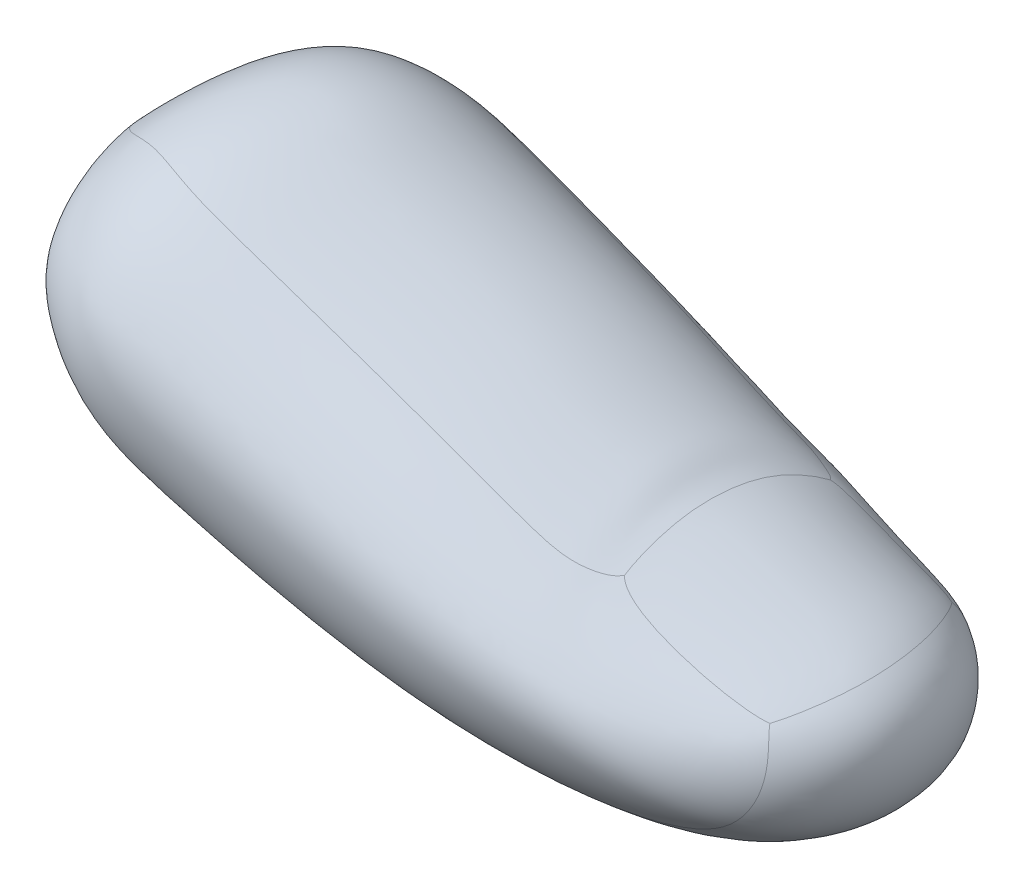
ISO-10303-21;
HEADER;
FILE_DESCRIPTION(('STEP AP214'),'2;1');
FILE_NAME('part.step','',(''),(''),'','','');
FILE_SCHEMA(('AUTOMOTIVE_DESIGN { 1 0 10303 214 1 1 1 1 }'));
ENDSEC;
DATA;
#1=APPLICATION_CONTEXT('core data for automotive mechanical design processes');
#2=APPLICATION_PROTOCOL_DEFINITION('international standard','automotive_design',2000,#1);
#3=PRODUCT_CONTEXT('',#1,'mechanical');
#4=PRODUCT('Part','Part','',(#3));
#5=PRODUCT_RELATED_PRODUCT_CATEGORY('part','',(#4));
#6=PRODUCT_DEFINITION_FORMATION('','',#4);
#7=PRODUCT_DEFINITION_CONTEXT('part definition',#1,'design');
#8=PRODUCT_DEFINITION('design','',#6,#7);
#9=PRODUCT_DEFINITION_SHAPE('','',#8);
#10=(LENGTH_UNIT() NAMED_UNIT(*) SI_UNIT(.MILLI.,.METRE.));
#11=(NAMED_UNIT(*) PLANE_ANGLE_UNIT() SI_UNIT($,.RADIAN.));
#12=(NAMED_UNIT(*) SI_UNIT($,.STERADIAN.) SOLID_ANGLE_UNIT());
#13=UNCERTAINTY_MEASURE_WITH_UNIT(LENGTH_MEASURE(1.E-05),#10,'distance_accuracy_value','');
#14=(GEOMETRIC_REPRESENTATION_CONTEXT(3) GLOBAL_UNCERTAINTY_ASSIGNED_CONTEXT((#13)) GLOBAL_UNIT_ASSIGNED_CONTEXT((#10,
#11,#12)) REPRESENTATION_CONTEXT('',''));
#15=CARTESIAN_POINT('',(0.,0.,0.));
#16=DIRECTION('',(0.,0.,1.));
#17=DIRECTION('',(1.,0.,0.));
#18=AXIS2_PLACEMENT_3D('',#15,#16,#17);
#19=CARTESIAN_POINT('',(776.248806926799,1297.13342170859,-16.5124378638908));
#20=CARTESIAN_POINT('',(776.243734939801,1297.17552307911,-16.8530550608123));
#21=CARTESIAN_POINT('',(776.440179296877,1297.34700811274,-17.8863612600429));
#22=CARTESIAN_POINT('',(776.469154670857,1297.18374944249,-19.5442080268799));
#23=CARTESIAN_POINT('',(776.303599867894,1296.7728971948,-20.2968129283823));
#24=CARTESIAN_POINT('',(776.31862177474,1296.64842207664,-20.5640886608683));
#25=CARTESIAN_POINT('',(776.412340965516,1297.30563996506,-16.2957291132153));
#26=CARTESIAN_POINT('',(776.56573103024,1297.56206096258,-16.7602547563611));
#27=CARTESIAN_POINT('',(776.829819008422,1297.81650707709,-17.8927326607063));
#28=CARTESIAN_POINT('',(776.861647729009,1297.64870278292,-19.7466520769386));
#29=CARTESIAN_POINT('',(776.632328903728,1297.13254949626,-20.5641596812097));
#30=CARTESIAN_POINT('',(776.490497246085,1296.7660106683,-20.8313999035141));
#31=CARTESIAN_POINT('',(777.196725960595,1297.98610527035,-15.2749707851825));
#32=CARTESIAN_POINT('',(777.331276181575,1298.31400007654,-16.0139073965886));
#33=CARTESIAN_POINT('',(777.600564939605,1298.69698334476,-17.7379171714884));
#34=CARTESIAN_POINT('',(777.645676933045,1298.47729333256,-20.3688216034117));
#35=CARTESIAN_POINT('',(777.430025455144,1297.6947320278,-21.6235197386159));
#36=CARTESIAN_POINT('',(777.3140356685,1297.1861044855,-22.0864027830923));
#37=CARTESIAN_POINT('',(779.068832037003,1298.90255451431,-14.5666994001202));
#38=CARTESIAN_POINT('',(779.243214461083,1299.32762032967,-15.524943924543));
#39=CARTESIAN_POINT('',(779.592422099675,1299.82412768138,-17.7608479096512));
#40=CARTESIAN_POINT('',(779.651087738069,1299.53938447969,-21.1730063951572));
#41=CARTESIAN_POINT('',(779.371698491866,1298.52503466165,-22.7998706151153));
#42=CARTESIAN_POINT('',(779.221375833895,1297.86570560166,-23.3999988915442));
#43=CARTESIAN_POINT('',(781.137603947715,1298.72497398352,-13.789576662406));
#44=CARTESIAN_POINT('',(781.36203529643,1299.22799066092,-14.8805923137662));
#45=CARTESIAN_POINT('',(781.885381407909,1299.84020747154,-17.4331271926069));
#46=CARTESIAN_POINT('',(782.265199849768,1299.54681845549,-21.3654366174796));
#47=CARTESIAN_POINT('',(782.195884489295,1298.3835461396,-23.2358135257908));
#48=CARTESIAN_POINT('',(782.151139320157,1297.62781870469,-23.9246706749869));
#49=CARTESIAN_POINT('',(783.889838462615,1297.52614326891,-13.9911079579648));
#50=CARTESIAN_POINT('',(784.027592381335,1298.03868880364,-15.059462714367));
#51=CARTESIAN_POINT('',(784.351015984833,1298.69745566611,-17.5644791917382));
#52=CARTESIAN_POINT('',(784.564727001333,1298.50551771249,-21.4288920164398));
#53=CARTESIAN_POINT('',(784.623203116717,1297.37528398652,-23.2733227409778));
#54=CARTESIAN_POINT('',(784.645568107469,1296.63679717278,-23.9561654320516));
#55=CARTESIAN_POINT('',(786.642079739642,1296.32732889029,-14.1926554873652));
#56=CARTESIAN_POINT('',(786.693144502818,1296.84939779074,-15.2383424052471));
#57=CARTESIAN_POINT('',(786.816648808278,1297.55470163886,-17.695835837937));
#58=CARTESIAN_POINT('',(786.864254152899,1297.46421696949,-21.4923474154));
#59=CARTESIAN_POINT('',(787.050518534205,1296.36703489964,-23.3108365993658));
#60=CARTESIAN_POINT('',(787.139981959307,1295.64578321543,-23.9876578887444));
#61=CARTESIAN_POINT('',(790.579349242589,1294.68499986567,-14.3905401011191));
#62=CARTESIAN_POINT('',(790.507565681173,1295.23486662918,-15.4087233281733));
#63=CARTESIAN_POINT('',(790.418432803363,1296.01583178992,-17.8164877398132));
#64=CARTESIAN_POINT('',(790.708995264565,1295.81178412399,-21.5598729908704));
#65=CARTESIAN_POINT('',(790.993866539675,1294.73850384191,-23.3194968612997));
#66=CARTESIAN_POINT('',(791.12179996451,1294.05280241703,-23.9707695484859));
#67=CARTESIAN_POINT('',(793.130545298139,1293.51072890705,-14.5447897773409));
#68=CARTESIAN_POINT('',(792.947888702681,1294.0688478498,-15.5317055585784));
#69=CARTESIAN_POINT('',(792.702311392216,1294.89225444332,-17.8926251407684));
#70=CARTESIAN_POINT('',(792.946395828154,1294.68906459456,-21.5645280390747));
#71=CARTESIAN_POINT('',(793.365812155512,1293.63506851349,-23.2785885483427));
#72=CARTESIAN_POINT('',(793.565948614163,1292.98223761643,-23.9099319567921));
#73=CARTESIAN_POINT('',(794.732470310774,1292.76371035453,-14.6856988715293));
#74=CARTESIAN_POINT('',(794.536024430702,1293.30900814682,-15.6426884743088));
#75=CARTESIAN_POINT('',(794.269895566784,1294.16205750971,-17.9962528621609));
#76=CARTESIAN_POINT('',(794.388305968912,1294.0232269031,-21.5877781331473));
#77=CARTESIAN_POINT('',(794.868732383544,1292.97526751071,-23.2968316212878));
#78=CARTESIAN_POINT('',(795.087589318305,1292.34915151292,-23.9127162158432));
#79=CARTESIAN_POINT('',(795.517143002034,1292.48110111188,-14.8957503684959));
#80=CARTESIAN_POINT('',(795.308942573039,1292.98396390087,-15.7751300446617));
#81=CARTESIAN_POINT('',(795.045114662433,1293.82163369162,-18.0734370109038));
#82=CARTESIAN_POINT('',(795.180259167151,1293.68358608956,-21.6097071785736));
#83=CARTESIAN_POINT('',(795.617671553086,1292.69940193109,-23.2964969121603));
#84=CARTESIAN_POINT('',(795.846008956027,1292.12382045966,-23.8806161344801));
#85=CARTESIAN_POINT('',(796.101894475691,1292.27286161092,-15.2205516571337));
#86=CARTESIAN_POINT('',(795.860511558456,1292.68358679256,-15.9496177170946));
#87=CARTESIAN_POINT('',(795.564903207338,1293.49023119101,-18.0879114205995));
#88=CARTESIAN_POINT('',(795.700122880264,1293.3521969394,-21.6242162847972));
#89=CARTESIAN_POINT('',(796.311537027804,1292.36376197722,-23.2071871037177));
#90=CARTESIAN_POINT('',(796.584028807795,1291.90198063366,-23.7121938882911));
#91=CARTESIAN_POINT('',(796.456400474653,1292.20702068511,-15.5128963194457));
#92=CARTESIAN_POINT('',(796.209409281284,1292.5222695586,-16.1063894811202));
#93=CARTESIAN_POINT('',(795.911483395004,1293.26929350593,-18.0975764168251));
#94=CARTESIAN_POINT('',(796.046651786795,1293.13124887279,-21.6338612480672));
#95=CARTESIAN_POINT('',(796.660516372291,1292.21377119728,-23.1291603436407));
#96=CARTESIAN_POINT('',(796.960567964272,1291.85930140401,-23.5544745046175));
#97=CARTESIAN_POINT('',(796.590715491962,1292.21578600641,-15.7162678871557));
#98=CARTESIAN_POINT('',(796.534377403913,1292.3777931038,-16.1147002518535));
#99=CARTESIAN_POINT('',(796.361311181774,1293.07803222366,-18.0999428042168));
#100=CARTESIAN_POINT('',(796.506495763757,1292.95301315593,-21.6330902927138));
#101=CARTESIAN_POINT('',(796.97887115642,1292.08173109551,-23.1236609486948));
#102=CARTESIAN_POINT('',(797.072787289703,1291.88943126724,-23.4090368543352));
#103=(BOUNDED_SURFACE() B_SPLINE_SURFACE(3,3,((#19,#20,#21,#22,#23,#24),(#25,#26,#27,#28,#29,
#30),(#31,#32,#33,#34,#35,#36),(#37,#38,#39,#40,#41,#42),(#43,#44,#45,#46,#47,#48),(#49,#50,#51,
#52,#53,#54),(#55,#56,#57,#58,#59,#60),(#61,#62,#63,#64,#65,#66),(#67,#68,#69,#70,#71,#72),(#73,
#74,#75,#76,#77,#78),(#79,#80,#81,#82,#83,#84),(#85,#86,#87,#88,#89,#90),(#91,#92,#93,#94,#95,
#96),(#97,#98,#99,#100,#101,#102)),.UNSPECIFIED.,.F.,.F.,.F.) B_SPLINE_SURFACE_WITH_KNOTS((4,1,
1,1,1,1,1,1,1,1,1,4),(4,1,1,4),(0.,1.,2.,3.,4.,5.,6.,7.,8.,9.,10.,11.),(0.,1.,2.,3.),
.UNSPECIFIED.) GEOMETRIC_REPRESENTATION_ITEM() RATIONAL_B_SPLINE_SURFACE(((0.75,1.,1.,1.,1.,
0.75),(1.,1.,1.,1.,1.,1.),(1.,1.,1.,1.,1.,1.),(1.,1.,1.,1.,1.,1.),(1.,1.,1.,1.,1.,1.),(1.,1.,1.,
1.,1.,1.),(1.,1.,1.,1.,1.,1.),(1.,1.,1.,1.,1.,1.),(1.,1.,1.,1.,1.,1.),(1.,1.,1.,1.,1.,1.),(1.,
1.,1.,1.,1.,1.),(1.,1.,1.,1.,1.,1.),(1.,1.,1.,1.,1.,1.),(0.75,1.,1.,1.,1.,0.75))) REPRESENTATION_ITEM('') SURFACE());
#104=CARTESIAN_POINT('',(796.590715491962,1292.21578600641,-15.7162678871557));
#105=CARTESIAN_POINT('',(796.456400474653,1292.20702068511,-15.5128963194457));
#106=CARTESIAN_POINT('',(796.101894475691,1292.27286161092,-15.2205516571337));
#107=CARTESIAN_POINT('',(795.517143002034,1292.48110111188,-14.8957503684959));
#108=CARTESIAN_POINT('',(794.732470310774,1292.76371035453,-14.6856988715293));
#109=CARTESIAN_POINT('',(793.130545298139,1293.51072890705,-14.5447897773409));
#110=CARTESIAN_POINT('',(790.579349242589,1294.68499986567,-14.3905401011191));
#111=CARTESIAN_POINT('',(786.642079739642,1296.32732889029,-14.1926554873652));
#112=CARTESIAN_POINT('',(783.889838462615,1297.52614326891,-13.9911079579648));
#113=CARTESIAN_POINT('',(781.137603947715,1298.72497398352,-13.789576662406));
#114=CARTESIAN_POINT('',(779.068832037003,1298.90255451431,-14.5666994001202));
#115=CARTESIAN_POINT('',(777.196725960595,1297.98610527035,-15.2749707851825));
#116=CARTESIAN_POINT('',(776.412340965516,1297.30563996506,-16.2957291132153));
#117=CARTESIAN_POINT('',(776.248806926799,1297.13342170859,-16.5124378638908));
#118=(BOUNDED_CURVE() B_SPLINE_CURVE(3,(#104,#105,#106,#107,#108,#109,#110,#111,#112,#113,#114,
#115,#116,#117),.UNSPECIFIED.,.F.,.F.) B_SPLINE_CURVE_WITH_KNOTS((4,1,1,1,1,1,1,1,1,1,1,4),(0.,
1.,2.,3.,4.,5.,6.,7.,8.,9.,10.,11.),
.UNSPECIFIED.) CURVE() GEOMETRIC_REPRESENTATION_ITEM() RATIONAL_B_SPLINE_CURVE((0.75,1.,1.,1.,
1.,1.,1.,1.,1.,1.,1.,1.,1.,0.75)) REPRESENTATION_ITEM(''));
#119=CARTESIAN_POINT('',(796.590715491962,1292.21578600641,-15.7162678871557));
#120=VERTEX_POINT('',#119);
#121=CARTESIAN_POINT('',(776.248806926798,1297.13342170859,-16.5124378638908));
#122=VERTEX_POINT('',#121);
#123=EDGE_CURVE('E89',#120,#122,#118,.T.);
#124=CARTESIAN_POINT('',(797.072787289703,1291.88943126724,-23.4090368543352));
#125=CARTESIAN_POINT('',(796.97887115642,1292.08173109551,-23.1236609486948));
#126=CARTESIAN_POINT('',(796.506495763757,1292.95301315593,-21.6330902927138));
#127=CARTESIAN_POINT('',(796.361311181774,1293.07803222366,-18.0999428042168));
#128=CARTESIAN_POINT('',(796.534377403913,1292.3777931038,-16.1147002518535));
#129=CARTESIAN_POINT('',(796.590715491962,1292.21578600641,-15.7162678871557));
#130=(BOUNDED_CURVE() B_SPLINE_CURVE(3,(#124,#125,#126,#127,#128,#129),.UNSPECIFIED.,.F.,
.F.) B_SPLINE_CURVE_WITH_KNOTS((4,1,1,4),(0.,1.,2.,3.),
.UNSPECIFIED.) CURVE() GEOMETRIC_REPRESENTATION_ITEM() RATIONAL_B_SPLINE_CURVE((0.75,1.,1.,1.,
1.,0.75)) REPRESENTATION_ITEM(''));
#131=CARTESIAN_POINT('',(797.072787289703,1291.88943126724,-23.4090368543352));
#132=VERTEX_POINT('',#131);
#133=EDGE_CURVE('E84',#132,#120,#130,.T.);
#134=CARTESIAN_POINT('',(797.072787289703,1291.88943126724,-23.4090368543352));
#135=CARTESIAN_POINT('',(796.960567964272,1291.85930140401,-23.5544745046175));
#136=CARTESIAN_POINT('',(796.584028807795,1291.90198063366,-23.7121938882911));
#137=CARTESIAN_POINT('',(795.846008956027,1292.12382045966,-23.8806161344801));
#138=CARTESIAN_POINT('',(795.087589318305,1292.34915151292,-23.9127162158432));
#139=CARTESIAN_POINT('',(793.565948614163,1292.98223761643,-23.9099319567921));
#140=CARTESIAN_POINT('',(791.12179996451,1294.05280241703,-23.9707695484859));
#141=CARTESIAN_POINT('',(787.139981959307,1295.64578321543,-23.9876578887444));
#142=CARTESIAN_POINT('',(784.645568107469,1296.63679717278,-23.9561654320516));
#143=CARTESIAN_POINT('',(782.151139320157,1297.62781870469,-23.9246706749869));
#144=CARTESIAN_POINT('',(779.221375833895,1297.86570560166,-23.3999988915442));
#145=CARTESIAN_POINT('',(777.3140356685,1297.1861044855,-22.0864027830923));
#146=CARTESIAN_POINT('',(776.490497246085,1296.7660106683,-20.8313999035141));
#147=CARTESIAN_POINT('',(776.31862177474,1296.64842207664,-20.5640886608683));
#148=(BOUNDED_CURVE() B_SPLINE_CURVE(3,(#134,#135,#136,#137,#138,#139,#140,#141,#142,#143,#144,
#145,#146,#147),.UNSPECIFIED.,.F.,.F.) B_SPLINE_CURVE_WITH_KNOTS((4,1,1,1,1,1,1,1,1,1,1,4),(0.,
1.,2.,3.,4.,5.,6.,7.,8.,9.,10.,11.),
.UNSPECIFIED.) CURVE() GEOMETRIC_REPRESENTATION_ITEM() RATIONAL_B_SPLINE_CURVE((0.75,1.,1.,1.,
1.,1.,1.,1.,1.,1.,1.,1.,1.,0.75)) REPRESENTATION_ITEM(''));
#149=CARTESIAN_POINT('',(776.31862177474,1296.64842207664,-20.5640886608683));
#150=VERTEX_POINT('',#149);
#151=EDGE_CURVE('E86',#150,#132,#148,.F.);
#152=CARTESIAN_POINT('',(776.31862177474,1296.64842207664,-20.5640886608683));
#153=CARTESIAN_POINT('',(776.303599867894,1296.7728971948,-20.2968129283823));
#154=CARTESIAN_POINT('',(776.469154670857,1297.18374944249,-19.5442080268799));
#155=CARTESIAN_POINT('',(776.440179296877,1297.34700811274,-17.8863612600429));
#156=CARTESIAN_POINT('',(776.243734939801,1297.17552307911,-16.8530550608123));
#157=CARTESIAN_POINT('',(776.248806926799,1297.13342170859,-16.5124378638908));
#158=(BOUNDED_CURVE() B_SPLINE_CURVE(3,(#152,#153,#154,#155,#156,#157),.UNSPECIFIED.,.F.,
.F.) B_SPLINE_CURVE_WITH_KNOTS((4,1,1,4),(0.,1.,2.,3.),
.UNSPECIFIED.) CURVE() GEOMETRIC_REPRESENTATION_ITEM() RATIONAL_B_SPLINE_CURVE((0.75,1.,1.,1.,
1.,0.75)) REPRESENTATION_ITEM(''));
#159=EDGE_CURVE('E107',#122,#150,#158,.F.);
#160=ORIENTED_EDGE('',*,*,#123,.F.);
#161=ORIENTED_EDGE('',*,*,#133,.F.);
#162=ORIENTED_EDGE('',*,*,#151,.F.);
#163=ORIENTED_EDGE('',*,*,#159,.F.);
#164=EDGE_LOOP('',(#160,#161,#162,#163));
#165=FACE_BOUND('',#164,.T.);
#166=ADVANCED_FACE('F37',(#165),#103,.T.);
#167=CARTESIAN_POINT('',(801.677664036057,1289.87355686285,-23.6272043992934));
#168=CARTESIAN_POINT('',(801.93773134174,1289.98035043801,-23.3350456484098));
#169=CARTESIAN_POINT('',(802.927357566541,1290.36773113354,-21.8237874687661));
#170=CARTESIAN_POINT('',(803.365335577512,1290.36169307218,-18.3419020633773));
#171=CARTESIAN_POINT('',(802.484501050872,1289.96587676347,-16.2777055081201));
#172=CARTESIAN_POINT('',(802.221422913571,1289.87016587372,-15.8550067801961));
#173=CARTESIAN_POINT('',(801.30547355706,1290.00478857986,-23.7291268132962));
#174=CARTESIAN_POINT('',(801.453417689439,1290.34960744718,-23.246731725521));
#175=CARTESIAN_POINT('',(802.277799686771,1290.79546724773,-21.7213542840307));
#176=CARTESIAN_POINT('',(802.661252695364,1290.7699825286,-18.3347868913965));
#177=CARTESIAN_POINT('',(801.919853451861,1290.3545177215,-16.2975516731374));
#178=CARTESIAN_POINT('',(801.807560045421,1290.01663090788,-15.6535804987481));
#179=CARTESIAN_POINT('',(799.982076190121,1290.4496174616,-23.7447967393803));
#180=CARTESIAN_POINT('',(800.180783642023,1290.81261105273,-23.1988858359838));
#181=CARTESIAN_POINT('',(800.644187503643,1291.42663554945,-21.6373999894228));
#182=CARTESIAN_POINT('',(800.943165315516,1291.34045341071,-18.1834694091974));
#183=CARTESIAN_POINT('',(800.448576256541,1290.84689302981,-16.1131265408997));
#184=CARTESIAN_POINT('',(800.228174341764,1290.55241075604,-15.3586968600128));
#185=CARTESIAN_POINT('',(798.034313535603,1291.28797573986,-23.6799684740343));
#186=CARTESIAN_POINT('',(798.221665732574,1291.57152136656,-23.1741907341076));
#187=CARTESIAN_POINT('',(798.459186742044,1292.28278263823,-21.6195905527203));
#188=CARTESIAN_POINT('',(798.263869927941,1292.34266349743,-18.1021097449499));
#189=CARTESIAN_POINT('',(797.81032029429,1291.81672806379,-15.9994823414614));
#190=CARTESIAN_POINT('',(797.601875424743,1291.5972641644,-15.2680498941088));
#191=CARTESIAN_POINT('',(797.27892274839,1291.72726130223,-23.5489751096825));
#192=CARTESIAN_POINT('',(797.297225940547,1291.94969099373,-23.1181615537598));
#193=CARTESIAN_POINT('',(796.966339740719,1292.77477743908,-21.6323193373605));
#194=CARTESIAN_POINT('',(796.811138968535,1292.8867709414,-18.1023091916085));
#195=CARTESIAN_POINT('',(796.859345526562,1292.23331664901,-16.1230110225867));
#196=CARTESIAN_POINT('',(796.781368597282,1292.06254423031,-15.5212070901681));
#197=CARTESIAN_POINT('',(797.072787289703,1291.88943126724,-23.4090368543352));
#198=CARTESIAN_POINT('',(796.97887115642,1292.08173109551,-23.1236609486948));
#199=CARTESIAN_POINT('',(796.506495763757,1292.95301315593,-21.6330902927138));
#200=CARTESIAN_POINT('',(796.361311181774,1293.07803222366,-18.0999428042168));
#201=CARTESIAN_POINT('',(796.534377403913,1292.3777931038,-16.1147002518535));
#202=CARTESIAN_POINT('',(796.590715491962,1292.21578600641,-15.7162678871557));
#203=(BOUNDED_SURFACE() B_SPLINE_SURFACE(3,3,((#167,#168,#169,#170,#171,#172),(#173,#174,#175,
#176,#177,#178),(#179,#180,#181,#182,#183,#184),(#185,#186,#187,#188,#189,#190),(#191,#192,#193,
#194,#195,#196),(#197,#198,#199,#200,#201,#202)),.UNSPECIFIED.,.F.,.F.,
.F.) B_SPLINE_SURFACE_WITH_KNOTS((4,1,1,4),(4,1,1,4),(0.,1.,2.,3.),(0.,1.,2.,3.),
.UNSPECIFIED.) GEOMETRIC_REPRESENTATION_ITEM() RATIONAL_B_SPLINE_SURFACE(((0.75,1.,1.,1.,1.,
0.75),(1.,1.,1.,1.,1.,1.),(1.,1.,1.,1.,1.,1.),(1.,1.,1.,1.,1.,1.),(1.,1.,1.,1.,1.,1.),(0.75,1.,
1.,1.,1.,0.75))) REPRESENTATION_ITEM('') SURFACE());
#204=CARTESIAN_POINT('',(801.677664036057,1289.87355686285,-23.6272043992934));
#205=CARTESIAN_POINT('',(801.30547355706,1290.00478857986,-23.7291268132962));
#206=CARTESIAN_POINT('',(799.982076190121,1290.4496174616,-23.7447967393803));
#207=CARTESIAN_POINT('',(798.034313535603,1291.28797573986,-23.6799684740343));
#208=CARTESIAN_POINT('',(797.27892274839,1291.72726130223,-23.5489751096825));
#209=CARTESIAN_POINT('',(797.072787289703,1291.88943126724,-23.4090368543352));
#210=(BOUNDED_CURVE() B_SPLINE_CURVE(3,(#204,#205,#206,#207,#208,#209),.UNSPECIFIED.,.F.,
.F.) B_SPLINE_CURVE_WITH_KNOTS((4,1,1,4),(0.,1.,2.,3.),
.UNSPECIFIED.) CURVE() GEOMETRIC_REPRESENTATION_ITEM() RATIONAL_B_SPLINE_CURVE((0.75,1.,1.,1.,
1.,0.75)) REPRESENTATION_ITEM(''));
#211=CARTESIAN_POINT('',(801.677664036057,1289.87355686285,-23.6272043992934));
#212=VERTEX_POINT('',#211);
#213=EDGE_CURVE('E92',#132,#212,#210,.F.);
#214=CARTESIAN_POINT('',(796.590715491962,1292.21578600641,-15.7162678871557));
#215=CARTESIAN_POINT('',(796.781368597282,1292.06254423031,-15.5212070901681));
#216=CARTESIAN_POINT('',(797.601875424743,1291.5972641644,-15.2680498941088));
#217=CARTESIAN_POINT('',(800.228174341764,1290.55241075604,-15.3586968600128));
#218=CARTESIAN_POINT('',(801.807560045421,1290.01663090788,-15.6535804987481));
#219=CARTESIAN_POINT('',(802.221422913571,1289.87016587372,-15.8550067801961));
#220=(BOUNDED_CURVE() B_SPLINE_CURVE(3,(#214,#215,#216,#217,#218,#219),.UNSPECIFIED.,.F.,
.F.) B_SPLINE_CURVE_WITH_KNOTS((4,1,1,4),(0.,1.,2.,3.),
.UNSPECIFIED.) CURVE() GEOMETRIC_REPRESENTATION_ITEM() RATIONAL_B_SPLINE_CURVE((0.75,1.,1.,1.,
1.,0.75)) REPRESENTATION_ITEM(''));
#221=CARTESIAN_POINT('',(802.221422913571,1289.87016587372,-15.8550067801961));
#222=VERTEX_POINT('',#221);
#223=EDGE_CURVE('E121',#222,#120,#220,.F.);
#224=CARTESIAN_POINT('',(802.221422913571,1289.87016587372,-15.8550067801961));
#225=CARTESIAN_POINT('',(802.484501050872,1289.96587676347,-16.2777055081201));
#226=CARTESIAN_POINT('',(803.365335577512,1290.36169307218,-18.3419020633773));
#227=CARTESIAN_POINT('',(802.927357566541,1290.36773113354,-21.8237874687661));
#228=CARTESIAN_POINT('',(801.93773134174,1289.98035043801,-23.3350456484098));
#229=CARTESIAN_POINT('',(801.677664036057,1289.87355686285,-23.6272043992934));
#230=(BOUNDED_CURVE() B_SPLINE_CURVE(3,(#224,#225,#226,#227,#228,#229),.UNSPECIFIED.,.F.,
.F.) B_SPLINE_CURVE_WITH_KNOTS((4,1,1,4),(0.,1.,2.,3.),
.UNSPECIFIED.) CURVE() GEOMETRIC_REPRESENTATION_ITEM() RATIONAL_B_SPLINE_CURVE((0.75,1.,1.,1.,
1.,0.75)) REPRESENTATION_ITEM(''));
#231=EDGE_CURVE('E60',#212,#222,#230,.F.);
#232=ORIENTED_EDGE('',*,*,#213,.F.);
#233=ORIENTED_EDGE('',*,*,#133,.T.);
#234=ORIENTED_EDGE('',*,*,#223,.F.);
#235=ORIENTED_EDGE('',*,*,#231,.F.);
#236=EDGE_LOOP('',(#232,#233,#234,#235));
#237=FACE_BOUND('',#236,.T.);
#238=ADVANCED_FACE('F94',(#237),#203,.T.);
#239=CARTESIAN_POINT('',(801.677664036057,1289.87355686285,-23.6272043992934));
#240=CARTESIAN_POINT('',(801.30547355706,1290.00478857986,-23.7291268132962));
#241=CARTESIAN_POINT('',(799.982076190121,1290.4496174616,-23.7447967393803));
#242=CARTESIAN_POINT('',(798.034313535603,1291.28797573986,-23.6799684740343));
#243=CARTESIAN_POINT('',(797.27892274839,1291.72726130223,-23.5489751096825));
#244=CARTESIAN_POINT('',(797.072787289703,1291.88943126724,-23.4090368543352));
#245=CARTESIAN_POINT('',(801.789787209361,1289.63553157069,-23.8174407361742));
#246=CARTESIAN_POINT('',(801.157529424671,1289.65996971254,-24.2115219010606));
#247=CARTESIAN_POINT('',(799.783368738217,1290.08662387047,-24.290707642766));
#248=CARTESIAN_POINT('',(797.846961338641,1291.00443011315,-24.185746213961));
#249=CARTESIAN_POINT('',(797.260619556243,1291.50483161074,-23.9797886656052));
#250=CARTESIAN_POINT('',(796.960567964272,1291.85930140401,-23.5544745046175));
#251=CARTESIAN_POINT('',(802.238400224159,1288.66181152076,-24.1722470919776));
#252=CARTESIAN_POINT('',(801.390134892487,1288.72655404381,-24.6157248106495));
#253=CARTESIAN_POINT('',(799.451942792215,1289.24867400266,-24.9128654098018));
#254=CARTESIAN_POINT('',(797.335073560245,1290.58150887801,-24.6542569922913));
#255=CARTESIAN_POINT('',(796.856520587795,1291.44019929011,-24.2172006728752));
#256=CARTESIAN_POINT('',(796.584028807795,1291.90198063366,-23.7121938882911));
#257=CARTESIAN_POINT('',(801.588602166399,1286.25027337419,-24.1173791523864));
#258=CARTESIAN_POINT('',(800.708624906545,1286.71163973044,-24.6368445577358));
#259=CARTESIAN_POINT('',(798.608339808858,1288.0896835084,-25.2592363760777));
#260=CARTESIAN_POINT('',(796.550283584738,1290.230097261,-25.1144225125144));
#261=CARTESIAN_POINT('',(796.074346358959,1291.54823898824,-24.4647353568108));
#262=CARTESIAN_POINT('',(795.846008956027,1292.12382045966,-23.8806161344801));
#263=CARTESIAN_POINT('',(798.711875081204,1285.17799798553,-24.1766152617788));
#264=CARTESIAN_POINT('',(798.222380590192,1285.81785968365,-24.7879134934103));
#265=CARTESIAN_POINT('',(796.921730481825,1287.51681549545,-25.5417342984943));
#266=CARTESIAN_POINT('',(795.701447577472,1290.26653091635,-25.2830857004903));
#267=CARTESIAN_POINT('',(795.306446253067,1291.72303551514,-24.5286008103986));
#268=CARTESIAN_POINT('',(795.087589318305,1292.34915151292,-23.9127162158432));
#269=CARTESIAN_POINT('',(795.196768106608,1285.21501089638,-24.2339016324822));
#270=CARTESIAN_POINT('',(795.138255378947,1285.93079282373,-24.8783739663544));
#271=CARTESIAN_POINT('',(794.766624233523,1287.67237511111,-25.6133833284538));
#272=CARTESIAN_POINT('',(794.14721458003,1290.77207921229,-25.3525884897281));
#273=CARTESIAN_POINT('',(793.766085072806,1292.3294067194,-24.5412753652308));
#274=CARTESIAN_POINT('',(793.565948614163,1292.98223761643,-23.9099319567921));
#275=CARTESIAN_POINT('',(791.480348438601,1285.76166250356,-24.1948061473869));
#276=CARTESIAN_POINT('',(791.610595765288,1286.5112300339,-24.9310159463375));
#277=CARTESIAN_POINT('',(791.765674005899,1288.38312861428,-25.7798335993385));
#278=CARTESIAN_POINT('',(791.476595813581,1291.69757557472,-25.4675091140418));
#279=CARTESIAN_POINT('',(791.249733389343,1293.36710099215,-24.622042235683));
#280=CARTESIAN_POINT('',(791.12179996451,1294.05280241703,-23.9707695484859));
#281=CARTESIAN_POINT('',(787.327420287965,1286.74118871246,-24.0461449772834));
#282=CARTESIAN_POINT('',(787.474267838462,1287.51472461949,-24.841827977405));
#283=CARTESIAN_POINT('',(787.658534992079,1289.53046737135,-25.7817939982244));
#284=CARTESIAN_POINT('',(787.401034703439,1293.13670686417,-25.553275151736));
#285=CARTESIAN_POINT('',(787.229445384389,1294.92453153121,-24.6644791781337));
#286=CARTESIAN_POINT('',(787.139981959307,1295.64578321543,-23.9876578887444));
#287=CARTESIAN_POINT('',(784.369364594037,1287.70479331812,-23.7694511606397));
#288=CARTESIAN_POINT('',(784.485487579548,1288.47118983393,-24.5883678041944));
#289=CARTESIAN_POINT('',(784.671430338778,1290.47349657397,-25.6306687787073));
#290=CARTESIAN_POINT('',(784.698916945836,1294.07459683,-25.5259481628609));
#291=CARTESIAN_POINT('',(784.667933098221,1295.89831035902,-24.6390081231146));
#292=CARTESIAN_POINT('',(784.645568107469,1296.63679717278,-23.9561654320516));
#293=CARTESIAN_POINT('',(781.411320769404,1288.66839503078,-23.4927658384941));
#294=CARTESIAN_POINT('',(781.496707172131,1289.42764629343,-24.3349099564616));
#295=CARTESIAN_POINT('',(781.68432874689,1291.41650395547,-25.4795412414455));
#296=CARTESIAN_POINT('',(781.996728834944,1295.01245384611,-25.4985795126886));
#297=CARTESIAN_POINT('',(782.10639415102,1296.8720912698,-24.6135278241938));
#298=CARTESIAN_POINT('',(782.151139320157,1297.62781870469,-23.9246706749869));
#299=CARTESIAN_POINT('',(777.777930232667,1290.07077550099,-22.9839119939174));
#300=CARTESIAN_POINT('',(777.8722267687,1290.73382105846,-23.7231295534675));
#301=CARTESIAN_POINT('',(778.150745737055,1292.4685920946,-24.737138731507));
#302=CARTESIAN_POINT('',(778.749151790253,1295.5834101198,-24.7737760537091));
#303=CARTESIAN_POINT('',(779.071053175924,1297.20637654167,-24.0001271679732));
#304=CARTESIAN_POINT('',(779.221375833895,1297.86570560166,-23.3999988915442));
#305=CARTESIAN_POINT('',(776.200615894992,1291.17355395671,-21.7654167051597));
#306=CARTESIAN_POINT('',(776.273354707435,1291.68502177966,-22.3355708681506));
#307=CARTESIAN_POINT('',(776.488238324022,1293.02317796422,-23.1178155817234));
#308=CARTESIAN_POINT('',(776.949738213197,1295.4255280787,-23.1461198702913));
#309=CARTESIAN_POINT('',(777.198045881864,1296.67747694318,-22.5492858275686));
#310=CARTESIAN_POINT('',(777.3140356685,1297.1861044855,-22.0864027830923));
#311=CARTESIAN_POINT('',(775.606855509345,1292.10331982651,-20.5032326137094));
#312=CARTESIAN_POINT('',(775.609054336931,1292.49988713849,-20.8561781708306));
#313=CARTESIAN_POINT('',(775.64645131208,1293.58602455405,-21.2781498728272));
#314=CARTESIAN_POINT('',(776.010657783104,1295.4494698152,-21.350093410787));
#315=CARTESIAN_POINT('',(776.348665588433,1296.39947184036,-21.0986401258294));
#316=CARTESIAN_POINT('',(776.490497246085,1296.7660106683,-20.8313999035141));
#317=CARTESIAN_POINT('',(775.495368120314,1292.33022832689,-20.2401603328548));
#318=CARTESIAN_POINT('',(775.440723839587,1292.64196623306,-20.2850969710043));
#319=CARTESIAN_POINT('',(775.388769188067,1293.73999456354,-20.5822992793663));
#320=CARTESIAN_POINT('',(775.734154511587,1295.49314401707,-20.6847663162304));
#321=CARTESIAN_POINT('',(776.161768210232,1296.40635836683,-20.5640531506976));
#322=CARTESIAN_POINT('',(776.31862177474,1296.64842207664,-20.5640886608683));
#323=(BOUNDED_SURFACE() B_SPLINE_SURFACE(3,3,((#239,#240,#241,#242,#243,#244),(#245,#246,#247,
#248,#249,#250),(#251,#252,#253,#254,#255,#256),(#257,#258,#259,#260,#261,#262),(#263,#264,#265,
#266,#267,#268),(#269,#270,#271,#272,#273,#274),(#275,#276,#277,#278,#279,#280),(#281,#282,#283,
#284,#285,#286),(#287,#288,#289,#290,#291,#292),(#293,#294,#295,#296,#297,#298),(#299,#300,#301,
#302,#303,#304),(#305,#306,#307,#308,#309,#310),(#311,#312,#313,#314,#315,#316),(#317,#318,#319,
#320,#321,#322)),.UNSPECIFIED.,.F.,.F.,.F.) B_SPLINE_SURFACE_WITH_KNOTS((4,1,1,1,1,1,1,1,1,1,1,
4),(4,1,1,4),(0.,1.,2.,3.,4.,5.,6.,7.,8.,9.,10.,11.),(0.,1.,2.,3.),
.UNSPECIFIED.) GEOMETRIC_REPRESENTATION_ITEM() RATIONAL_B_SPLINE_SURFACE(((0.75,1.,1.,1.,1.,
0.75),(1.,1.,1.,1.,1.,1.),(1.,1.,1.,1.,1.,1.),(1.,1.,1.,1.,1.,1.),(1.,1.,1.,1.,1.,1.),(1.,1.,1.,
1.,1.,1.),(1.,1.,1.,1.,1.,1.),(1.,1.,1.,1.,1.,1.),(1.,1.,1.,1.,1.,1.),(1.,1.,1.,1.,1.,1.),(1.,
1.,1.,1.,1.,1.),(1.,1.,1.,1.,1.,1.),(1.,1.,1.,1.,1.,1.),(0.75,1.,1.,1.,1.,0.75))) REPRESENTATION_ITEM('') SURFACE());
#324=CARTESIAN_POINT('',(801.677664036057,1289.87355686285,-23.6272043992934));
#325=CARTESIAN_POINT('',(801.789787209361,1289.63553157069,-23.8174407361742));
#326=CARTESIAN_POINT('',(802.238400224159,1288.66181152076,-24.1722470919776));
#327=CARTESIAN_POINT('',(801.588602166399,1286.25027337419,-24.1173791523864));
#328=CARTESIAN_POINT('',(798.711875081204,1285.17799798553,-24.1766152617788));
#329=CARTESIAN_POINT('',(795.196768106608,1285.21501089638,-24.2339016324822));
#330=CARTESIAN_POINT('',(791.480348438601,1285.76166250356,-24.1948061473869));
#331=CARTESIAN_POINT('',(787.327420287965,1286.74118871246,-24.0461449772834));
#332=CARTESIAN_POINT('',(784.369364594037,1287.70479331812,-23.7694511606397));
#333=CARTESIAN_POINT('',(781.411320769404,1288.66839503078,-23.4927658384941));
#334=CARTESIAN_POINT('',(777.777930232667,1290.07077550099,-22.9839119939174));
#335=CARTESIAN_POINT('',(776.200615894992,1291.17355395671,-21.7654167051597));
#336=CARTESIAN_POINT('',(775.606855509345,1292.10331982651,-20.5032326137094));
#337=CARTESIAN_POINT('',(775.495368120314,1292.33022832689,-20.2401603328548));
#338=(BOUNDED_CURVE() B_SPLINE_CURVE(3,(#324,#325,#326,#327,#328,#329,#330,#331,#332,#333,#334,
#335,#336,#337),.UNSPECIFIED.,.F.,.F.) B_SPLINE_CURVE_WITH_KNOTS((4,1,1,1,1,1,1,1,1,1,1,4),(0.,
1.,2.,3.,4.,5.,6.,7.,8.,9.,10.,11.),
.UNSPECIFIED.) CURVE() GEOMETRIC_REPRESENTATION_ITEM() RATIONAL_B_SPLINE_CURVE((0.75,1.,1.,1.,
1.,1.,1.,1.,1.,1.,1.,1.,1.,0.75)) REPRESENTATION_ITEM(''));
#339=CARTESIAN_POINT('',(775.495368120314,1292.33022832689,-20.2401603328548));
#340=VERTEX_POINT('',#339);
#341=EDGE_CURVE('E142',#340,#212,#338,.F.);
#342=CARTESIAN_POINT('',(775.495368120314,1292.33022832689,-20.2401603328548));
#343=CARTESIAN_POINT('',(775.440723839587,1292.64196623306,-20.2850969710043));
#344=CARTESIAN_POINT('',(775.388769188067,1293.73999456354,-20.5822992793663));
#345=CARTESIAN_POINT('',(775.734154511587,1295.49314401707,-20.6847663162304));
#346=CARTESIAN_POINT('',(776.161768210232,1296.40635836683,-20.5640531506976));
#347=CARTESIAN_POINT('',(776.31862177474,1296.64842207664,-20.5640886608683));
#348=(BOUNDED_CURVE() B_SPLINE_CURVE(3,(#342,#343,#344,#345,#346,#347),.UNSPECIFIED.,.F.,
.F.) B_SPLINE_CURVE_WITH_KNOTS((4,1,1,4),(0.,1.,2.,3.),
.UNSPECIFIED.) CURVE() GEOMETRIC_REPRESENTATION_ITEM() RATIONAL_B_SPLINE_CURVE((0.75,1.,1.,1.,
1.,0.75)) REPRESENTATION_ITEM(''));
#349=EDGE_CURVE('E101',#150,#340,#348,.F.);
#350=ORIENTED_EDGE('',*,*,#341,.F.);
#351=ORIENTED_EDGE('',*,*,#349,.F.);
#352=ORIENTED_EDGE('',*,*,#151,.T.);
#353=ORIENTED_EDGE('',*,*,#213,.T.);
#354=EDGE_LOOP('',(#350,#351,#352,#353));
#355=FACE_BOUND('',#354,.T.);
#356=ADVANCED_FACE('F99',(#355),#323,.T.);
#357=CARTESIAN_POINT('',(775.495368120314,1292.33022832689,-20.2401603328548));
#358=CARTESIAN_POINT('',(775.440723839587,1292.64196623306,-20.2850969710043));
#359=CARTESIAN_POINT('',(775.388769188067,1293.73999456354,-20.5822992793663));
#360=CARTESIAN_POINT('',(775.734154511587,1295.49314401707,-20.6847663162304));
#361=CARTESIAN_POINT('',(776.161768210232,1296.40635836683,-20.5640531506976));
#362=CARTESIAN_POINT('',(776.31862177474,1296.64842207664,-20.5640886608683));
#363=CARTESIAN_POINT('',(775.438525012001,1292.2453989211,-19.9321514138831));
#364=CARTESIAN_POINT('',(775.272393342244,1292.78404532763,-19.7140157711779));
#365=CARTESIAN_POINT('',(775.131087064045,1293.89396457304,-19.8864486859162));
#366=CARTESIAN_POINT('',(775.45765124007,1295.53681821895,-20.0194392216846));
#367=CARTESIAN_POINT('',(775.97487083205,1296.41324489332,-20.0294661755659));
#368=CARTESIAN_POINT('',(776.303599867894,1296.7728971948,-20.2968129283823));
#369=CARTESIAN_POINT('',(775.448315034934,1291.87205851467,-19.03478009963));
#370=CARTESIAN_POINT('',(775.263371723355,1292.53749634711,-18.9090836691708));
#371=CARTESIAN_POINT('',(774.942145579886,1293.94699802113,-18.9427120210013));
#372=CARTESIAN_POINT('',(775.290718584114,1295.68757328996,-19.1541573029948));
#373=CARTESIAN_POINT('',(776.076661612705,1296.71879610205,-19.3417639768104));
#374=CARTESIAN_POINT('',(776.469154670857,1297.18374944249,-19.5442080268799));
#375=CARTESIAN_POINT('',(775.324094386818,1292.25636578293,-16.9135122746434));
#376=CARTESIAN_POINT('',(775.175971367145,1292.8506895055,-17.1357492075912));
#377=CARTESIAN_POINT('',(774.903565897771,1294.19823288463,-17.4080213750977));
#378=CARTESIAN_POINT('',(775.262726670343,1295.87998955866,-17.699688767497));
#379=CARTESIAN_POINT('',(776.050539585331,1296.87750914839,-17.8799898593687));
#380=CARTESIAN_POINT('',(776.440179296877,1297.34700811274,-17.8863612600429));
#381=CARTESIAN_POINT('',(775.296184303258,1292.91176750751,-15.91688168854));
#382=CARTESIAN_POINT('',(775.166601988119,1293.36326108895,-16.215125049967));
#383=CARTESIAN_POINT('',(775.069979655498,1294.49941471677,-16.2193046491728));
#384=CARTESIAN_POINT('',(775.399299638921,1295.99477277571,-16.5707092232524));
#385=CARTESIAN_POINT('',(775.921738849362,1296.78898519564,-16.9458553652526));
#386=CARTESIAN_POINT('',(776.243734939801,1297.17552307911,-16.8530550608123));
#387=CARTESIAN_POINT('',(775.347722631186,1293.09774949662,-15.5870819970705));
#388=CARTESIAN_POINT('',(775.308700637567,1293.4164872819,-15.5713038320385));
#389=CARTESIAN_POINT('',(775.308647533929,1294.59488771172,-15.4185564259348));
#390=CARTESIAN_POINT('',(775.654389129487,1296.13637693387,-15.8381440125098));
#391=CARTESIAN_POINT('',(776.090344875078,1296.9191020816,-16.3885294176557));
#392=CARTESIAN_POINT('',(776.248806926799,1297.13342170859,-16.5124378638908));
#393=(BOUNDED_SURFACE() B_SPLINE_SURFACE(3,3,((#357,#358,#359,#360,#361,#362),(#363,#364,#365,
#366,#367,#368),(#369,#370,#371,#372,#373,#374),(#375,#376,#377,#378,#379,#380),(#381,#382,#383,
#384,#385,#386),(#387,#388,#389,#390,#391,#392)),.UNSPECIFIED.,.F.,.F.,
.F.) B_SPLINE_SURFACE_WITH_KNOTS((4,1,1,4),(4,1,1,4),(0.,1.,2.,3.),(0.,1.,2.,3.),
.UNSPECIFIED.) GEOMETRIC_REPRESENTATION_ITEM() RATIONAL_B_SPLINE_SURFACE(((0.75,1.,1.,1.,1.,
0.75),(1.,1.,1.,1.,1.,1.),(1.,1.,1.,1.,1.,1.),(1.,1.,1.,1.,1.,1.),(1.,1.,1.,1.,1.,1.),(0.75,1.,
1.,1.,1.,0.75))) REPRESENTATION_ITEM('') SURFACE());
#394=CARTESIAN_POINT('',(775.347722631186,1293.09774949662,-15.5870819970705));
#395=CARTESIAN_POINT('',(775.296184303258,1292.91176750751,-15.91688168854));
#396=CARTESIAN_POINT('',(775.324094386818,1292.25636578293,-16.9135122746434));
#397=CARTESIAN_POINT('',(775.448315034934,1291.87205851467,-19.03478009963));
#398=CARTESIAN_POINT('',(775.438525012001,1292.2453989211,-19.9321514138831));
#399=CARTESIAN_POINT('',(775.495368120314,1292.33022832689,-20.2401603328548));
#400=(BOUNDED_CURVE() B_SPLINE_CURVE(3,(#394,#395,#396,#397,#398,#399),.UNSPECIFIED.,.F.,
.F.) B_SPLINE_CURVE_WITH_KNOTS((4,1,1,4),(0.,1.,2.,3.),
.UNSPECIFIED.) CURVE() GEOMETRIC_REPRESENTATION_ITEM() RATIONAL_B_SPLINE_CURVE((0.75,1.,1.,1.,
1.,0.75)) REPRESENTATION_ITEM(''));
#401=CARTESIAN_POINT('',(775.347722631186,1293.09774949662,-15.5870819970705));
#402=VERTEX_POINT('',#401);
#403=EDGE_CURVE('E50',#402,#340,#400,.T.);
#404=CARTESIAN_POINT('',(776.248806926799,1297.13342170859,-16.5124378638908));
#405=CARTESIAN_POINT('',(776.090344875078,1296.9191020816,-16.3885294176557));
#406=CARTESIAN_POINT('',(775.654389129487,1296.13637693387,-15.8381440125098));
#407=CARTESIAN_POINT('',(775.308647533929,1294.59488771172,-15.4185564259348));
#408=CARTESIAN_POINT('',(775.308700637567,1293.4164872819,-15.5713038320385));
#409=CARTESIAN_POINT('',(775.347722631186,1293.09774949662,-15.5870819970705));
#410=(BOUNDED_CURVE() B_SPLINE_CURVE(3,(#404,#405,#406,#407,#408,#409),.UNSPECIFIED.,.F.,
.F.) B_SPLINE_CURVE_WITH_KNOTS((4,1,1,4),(0.,1.,2.,3.),
.UNSPECIFIED.) CURVE() GEOMETRIC_REPRESENTATION_ITEM() RATIONAL_B_SPLINE_CURVE((0.75,1.,1.,1.,
1.,0.75)) REPRESENTATION_ITEM(''));
#411=EDGE_CURVE('E134',#122,#402,#410,.T.);
#412=ORIENTED_EDGE('',*,*,#403,.F.);
#413=ORIENTED_EDGE('',*,*,#411,.F.);
#414=ORIENTED_EDGE('',*,*,#159,.T.);
#415=ORIENTED_EDGE('',*,*,#349,.T.);
#416=EDGE_LOOP('',(#412,#413,#414,#415));
#417=FACE_BOUND('',#416,.T.);
#418=ADVANCED_FACE('F184',(#417),#393,.T.);
#419=CARTESIAN_POINT('',(796.590715491962,1292.21578600641,-15.7162678871557));
#420=CARTESIAN_POINT('',(796.781368597282,1292.06254423031,-15.5212070901681));
#421=CARTESIAN_POINT('',(797.601875424743,1291.5972641644,-15.2680498941088));
#422=CARTESIAN_POINT('',(800.228174341764,1290.55241075604,-15.3586968600128));
#423=CARTESIAN_POINT('',(801.807560045421,1290.01663090788,-15.6535804987481));
#424=CARTESIAN_POINT('',(802.221422913571,1289.87016587372,-15.8550067801961));
#425=CARTESIAN_POINT('',(796.456400474653,1292.20702068511,-15.5128963194457));
#426=CARTESIAN_POINT('',(796.703391668012,1291.89177181163,-14.9194031577712));
#427=CARTESIAN_POINT('',(797.393430555197,1291.37780026501,-14.536617446767));
#428=CARTESIAN_POINT('',(800.007772426986,1290.25792848226,-14.6042671791473));
#429=CARTESIAN_POINT('',(801.69526663898,1289.67874409426,-15.009609324348));
#430=CARTESIAN_POINT('',(802.372207644421,1289.62798994983,-15.6337343337308));
#431=CARTESIAN_POINT('',(796.101894475691,1292.27286161092,-15.2205516571337));
#432=CARTESIAN_POINT('',(796.343277392897,1291.86213642927,-14.4914855971728));
#433=CARTESIAN_POINT('',(797.013200710658,1291.02588010113,-13.7135150608559));
#434=CARTESIAN_POINT('',(799.62075382685,1289.5735597681,-13.656891323951));
#435=CARTESIAN_POINT('',(801.987492256726,1288.74266164682,-14.4709598450389));
#436=CARTESIAN_POINT('',(802.911977053643,1288.62885446417,-15.2325046979067));
#437=CARTESIAN_POINT('',(795.517143002034,1292.48110111188,-14.8957503684959));
#438=CARTESIAN_POINT('',(795.725343431029,1291.97823832289,-14.0163706923194));
#439=CARTESIAN_POINT('',(796.294317236417,1290.80445695773,-12.7971589539092));
#440=CARTESIAN_POINT('',(798.195378055198,1288.70210274935,-12.3514974354159));
#441=CARTESIAN_POINT('',(801.003040643736,1286.96346220631,-13.6927451753607));
#442=CARTESIAN_POINT('',(802.028177021871,1286.39209110541,-14.6917307947437));
#443=CARTESIAN_POINT('',(794.732470310774,1292.76371035453,-14.6856988715293));
#444=CARTESIAN_POINT('',(794.928916190855,1292.21841256222,-13.7287092687497));
#445=CARTESIAN_POINT('',(795.448570847253,1290.89027075593,-12.2543152455052));
#446=CARTESIAN_POINT('',(796.604027114957,1288.46163349488,-11.8507896693199));
#447=CARTESIAN_POINT('',(798.204329304482,1286.35312975243,-13.2734718379118));
#448=CARTESIAN_POINT('',(798.768735179018,1285.56495611815,-14.2513754329007));
#449=CARTESIAN_POINT('',(793.130545298139,1293.51072890705,-14.5447897773409));
#450=CARTESIAN_POINT('',(793.313201893597,1292.95260996429,-13.5578739961143));
#451=CARTESIAN_POINT('',(793.798250964983,1291.54354078673,-11.9711304533544));
#452=CARTESIAN_POINT('',(794.452874810147,1288.88360469527,-11.324971775997));
#453=CARTESIAN_POINT('',(794.780305651341,1286.72735825758,-12.5344709983774));
#454=CARTESIAN_POINT('',(794.860769954151,1285.86152811839,-13.4577400936789));
#455=CARTESIAN_POINT('',(790.579349242589,1294.68499986567,-14.3905401011191));
#456=CARTESIAN_POINT('',(790.651132804015,1294.13513310218,-13.3723568740757));
#457=CARTESIAN_POINT('',(790.84913417188,1292.7166312089,-11.7073883774987));
#458=CARTESIAN_POINT('',(790.992610733701,1290.00169346849,-10.8017210557088));
#459=CARTESIAN_POINT('',(790.677468328379,1287.76448087101,-11.8184081685125));
#460=CARTESIAN_POINT('',(790.594874548649,1286.8240859402,-12.712403649578));
#461=CARTESIAN_POINT('',(786.642079739642,1296.32732889029,-14.1926554873652));
#462=CARTESIAN_POINT('',(786.591014976477,1295.80525998985,-13.1469685694833));
#463=CARTESIAN_POINT('',(786.510260229274,1294.42228823618,-11.4217143306565));
#464=CARTESIAN_POINT('',(786.077901273161,1291.70539182279,-10.404207437089));
#465=CARTESIAN_POINT('',(785.942962861135,1289.23876641725,-11.4073335337705));
#466=CARTESIAN_POINT('',(785.957112014436,1288.20091538544,-12.2898215256762));
#467=CARTESIAN_POINT('',(783.889838462615,1297.52614326891,-13.9911079579648));
#468=CARTESIAN_POINT('',(783.752084543895,1297.01359773418,-12.9227532015735));
#469=CARTESIAN_POINT('',(783.524492472541,1295.6221824577,-11.1543506533361));
#470=CARTESIAN_POINT('',(783.087182159333,1292.80450547897,-10.1381002850656));
#471=CARTESIAN_POINT('',(782.948493237913,1290.38320313228,-11.1447568312589));
#472=CARTESIAN_POINT('',(782.971405603576,1289.35608367367,-12.0171745313618));
#473=CARTESIAN_POINT('',(781.137603947715,1298.72497398352,-13.789576662406));
#474=CARTESIAN_POINT('',(780.913172599,1298.22195730611,-12.6985610110457));
#475=CARTESIAN_POINT('',(780.538793315619,1296.82210740712,-10.8870332844236));
#476=CARTESIAN_POINT('',(780.096386123799,1293.90360356289,-9.87196308361414));
#477=CARTESIAN_POINT('',(779.953993595202,1291.52764624153,-10.8821778535354));
#478=CARTESIAN_POINT('',(779.985681483274,1290.51126458837,-11.7445306563464));
#479=CARTESIAN_POINT('',(779.068832037003,1298.90255451431,-14.5666994001202));
#480=CARTESIAN_POINT('',(778.894449612925,1298.47748869896,-13.6084548756974));
#481=CARTESIAN_POINT('',(778.5461275552,1297.27373278925,-12.0113807631036));
#482=CARTESIAN_POINT('',(777.95278084058,1294.73510294793,-11.10272430687));
#483=CARTESIAN_POINT('',(777.554701149571,1292.6596119901,-11.9706784719445));
#484=CARTESIAN_POINT('',(777.437258058607,1291.76536626861,-12.7208687064084));
#485=CARTESIAN_POINT('',(777.196725960595,1297.98610527035,-15.2749707851825));
#486=CARTESIAN_POINT('',(777.062175739626,1297.65821046416,-14.5360341737765));
#487=CARTESIAN_POINT('',(776.79326361373,1296.7296145076,-13.3042975030521));
#488=CARTESIAN_POINT('',(776.335573168401,1294.77107085426,-12.603532035616));
#489=CARTESIAN_POINT('',(776.028563263854,1293.1700466632,-13.2728218999983));
#490=CARTESIAN_POINT('',(775.938018405088,1292.48024994569,-13.8513331903101));
#491=CARTESIAN_POINT('',(776.412340965516,1297.30563996506,-16.2957291132153));
#492=CARTESIAN_POINT('',(776.258950900784,1297.04921896757,-15.8312034700588));
#493=CARTESIAN_POINT('',(775.909478620062,1296.27798109202,-15.1055788017671));
#494=CARTESIAN_POINT('',(775.547315412369,1294.69036070666,-14.6178082026861));
#495=CARTESIAN_POINT('',(775.450799287023,1293.46971347485,-14.9274826141099));
#496=CARTESIAN_POINT('',(775.438282952714,1292.96499370046,-15.2730604706115));
#497=CARTESIAN_POINT('',(776.248806926799,1297.13342170859,-16.5124378638908));
#498=CARTESIAN_POINT('',(776.090344875078,1296.9191020816,-16.3885294176557));
#499=CARTESIAN_POINT('',(775.654389129487,1296.13637693387,-15.8381440125098));
#500=CARTESIAN_POINT('',(775.308647533929,1294.59488771172,-15.4185564259348));
#501=CARTESIAN_POINT('',(775.308700637567,1293.4164872819,-15.5713038320385));
#502=CARTESIAN_POINT('',(775.347722631186,1293.09774949662,-15.5870819970705));
#503=(BOUNDED_SURFACE() B_SPLINE_SURFACE(3,3,((#419,#420,#421,#422,#423,#424),(#425,#426,#427,
#428,#429,#430),(#431,#432,#433,#434,#435,#436),(#437,#438,#439,#440,#441,#442),(#443,#444,#445,
#446,#447,#448),(#449,#450,#451,#452,#453,#454),(#455,#456,#457,#458,#459,#460),(#461,#462,#463,
#464,#465,#466),(#467,#468,#469,#470,#471,#472),(#473,#474,#475,#476,#477,#478),(#479,#480,#481,
#482,#483,#484),(#485,#486,#487,#488,#489,#490),(#491,#492,#493,#494,#495,#496),(#497,#498,#499,
#500,#501,#502)),.UNSPECIFIED.,.F.,.F.,.F.) B_SPLINE_SURFACE_WITH_KNOTS((4,1,1,1,1,1,1,1,1,1,1,
4),(4,1,1,4),(0.,1.,2.,3.,4.,5.,6.,7.,8.,9.,10.,11.),(0.,1.,2.,3.),
.UNSPECIFIED.) GEOMETRIC_REPRESENTATION_ITEM() RATIONAL_B_SPLINE_SURFACE(((0.75,1.,1.,1.,1.,
0.75),(1.,1.,1.,1.,1.,1.),(1.,1.,1.,1.,1.,1.),(1.,1.,1.,1.,1.,1.),(1.,1.,1.,1.,1.,1.),(1.,1.,1.,
1.,1.,1.),(1.,1.,1.,1.,1.,1.),(1.,1.,1.,1.,1.,1.),(1.,1.,1.,1.,1.,1.),(1.,1.,1.,1.,1.,1.),(1.,
1.,1.,1.,1.,1.),(1.,1.,1.,1.,1.,1.),(1.,1.,1.,1.,1.,1.),(0.75,1.,1.,1.,1.,0.75))) REPRESENTATION_ITEM('') SURFACE());
#504=CARTESIAN_POINT('',(802.221422913571,1289.87016587372,-15.8550067801961));
#505=CARTESIAN_POINT('',(802.372207644421,1289.62798994983,-15.6337343337308));
#506=CARTESIAN_POINT('',(802.911977053643,1288.62885446417,-15.2325046979067));
#507=CARTESIAN_POINT('',(802.028177021871,1286.39209110541,-14.6917307947437));
#508=CARTESIAN_POINT('',(798.768735179018,1285.56495611815,-14.2513754329007));
#509=CARTESIAN_POINT('',(794.860769954151,1285.86152811839,-13.4577400936789));
#510=CARTESIAN_POINT('',(790.594874548649,1286.8240859402,-12.712403649578));
#511=CARTESIAN_POINT('',(785.957112014436,1288.20091538544,-12.2898215256762));
#512=CARTESIAN_POINT('',(782.971405603576,1289.35608367367,-12.0171745313618));
#513=CARTESIAN_POINT('',(779.985681483274,1290.51126458837,-11.7445306563464));
#514=CARTESIAN_POINT('',(777.437258058607,1291.76536626861,-12.7208687064084));
#515=CARTESIAN_POINT('',(775.938018405088,1292.48024994569,-13.8513331903101));
#516=CARTESIAN_POINT('',(775.438282952714,1292.96499370046,-15.2730604706115));
#517=CARTESIAN_POINT('',(775.347722631186,1293.09774949662,-15.5870819970705));
#518=(BOUNDED_CURVE() B_SPLINE_CURVE(3,(#504,#505,#506,#507,#508,#509,#510,#511,#512,#513,#514,
#515,#516,#517),.UNSPECIFIED.,.F.,.F.) B_SPLINE_CURVE_WITH_KNOTS((4,1,1,1,1,1,1,1,1,1,1,4),(0.,
1.,2.,3.,4.,5.,6.,7.,8.,9.,10.,11.),
.UNSPECIFIED.) CURVE() GEOMETRIC_REPRESENTATION_ITEM() RATIONAL_B_SPLINE_CURVE((0.75,1.,1.,1.,
1.,1.,1.,1.,1.,1.,1.,1.,1.,0.75)) REPRESENTATION_ITEM(''));
#519=EDGE_CURVE('E11',#222,#402,#518,.T.);
#520=ORIENTED_EDGE('',*,*,#123,.T.);
#521=ORIENTED_EDGE('',*,*,#411,.T.);
#522=ORIENTED_EDGE('',*,*,#519,.F.);
#523=ORIENTED_EDGE('',*,*,#223,.T.);
#524=EDGE_LOOP('',(#520,#521,#522,#523));
#525=FACE_BOUND('',#524,.T.);
#526=ADVANCED_FACE('F180',(#525),#503,.T.);
#527=CARTESIAN_POINT('',(802.221422913571,1289.87016587372,-15.8550067801961));
#528=CARTESIAN_POINT('',(802.484501050872,1289.96587676347,-16.2777055081201));
#529=CARTESIAN_POINT('',(803.365335577512,1290.36169307218,-18.3419020633773));
#530=CARTESIAN_POINT('',(802.927357566541,1290.36773113354,-21.8237874687661));
#531=CARTESIAN_POINT('',(801.93773134174,1289.98035043801,-23.3350456484098));
#532=CARTESIAN_POINT('',(801.677664036057,1289.87355686285,-23.6272043992934));
#533=CARTESIAN_POINT('',(802.372207644421,1289.62798994983,-15.6337343337308));
#534=CARTESIAN_POINT('',(803.049148649871,1289.57723580542,-16.2578593431029));
#535=CARTESIAN_POINT('',(804.06941845966,1289.95340361575,-18.3490172353797));
#536=CARTESIAN_POINT('',(803.576915446319,1289.93999501935,-21.9262206535015));
#537=CARTESIAN_POINT('',(802.422044994042,1289.61109342884,-23.4233595712986));
#538=CARTESIAN_POINT('',(801.789787209361,1289.63553157069,-23.8174407361742));
#539=CARTESIAN_POINT('',(802.911977053643,1288.62885446417,-15.2325046979067));
#540=CARTESIAN_POINT('',(803.836461850568,1288.51504728151,-15.9940495507745));
#541=CARTESIAN_POINT('',(805.167662608403,1288.89071667216,-18.2261604411576));
#542=CARTESIAN_POINT('',(804.541534782314,1288.86021886434,-22.2519990978137));
#543=CARTESIAN_POINT('',(803.086665555841,1288.5970689977,-23.7287693733166));
#544=CARTESIAN_POINT('',(802.238400224159,1288.66181152076,-24.1722470919776));
#545=CARTESIAN_POINT('',(802.028177021871,1286.39209110541,-14.6917307947437));
#546=CARTESIAN_POINT('',(803.053313399988,1285.8207200045,-15.6907164141267));
#547=CARTESIAN_POINT('',(804.346196323964,1285.2738761439,-18.3454111517464));
#548=CARTESIAN_POINT('',(803.888203367969,1285.32148537085,-22.1424439439918));
#549=CARTESIAN_POINT('',(802.468579426253,1285.78890701794,-23.5979137470369));
#550=CARTESIAN_POINT('',(801.588602166399,1286.25027337419,-24.1173791523864));
#551=CARTESIAN_POINT('',(798.768735179018,1285.56495611815,-14.2513754329007));
#552=CARTESIAN_POINT('',(799.333141053555,1284.77678248388,-15.2292790279003));
#553=CARTESIAN_POINT('',(799.990462362169,1283.73259168921,-17.7182112392852));
#554=CARTESIAN_POINT('',(799.858697427924,1283.67764530675,-21.8739449087485));
#555=CARTESIAN_POINT('',(799.201369572216,1284.53813628741,-23.565317030169));
#556=CARTESIAN_POINT('',(798.711875081204,1285.17799798553,-24.1766152617788));
#557=CARTESIAN_POINT('',(794.860769954151,1285.86152811839,-13.4577400936789));
#558=CARTESIAN_POINT('',(794.941234256952,1284.99569797919,-14.3810091889588));
#559=CARTESIAN_POINT('',(794.935660627012,1283.68862386012,-16.8645863477304));
#560=CARTESIAN_POINT('',(795.117700599485,1283.37768354702,-21.7465493251775));
#561=CARTESIAN_POINT('',(795.255280834267,1284.49922896902,-23.5894292985992));
#562=CARTESIAN_POINT('',(795.196768106608,1285.21501089638,-24.2339016324822));
#563=CARTESIAN_POINT('',(790.594874548649,1286.8240859402,-12.712403649578));
#564=CARTESIAN_POINT('',(790.512280768919,1285.88369100937,-13.6063991306327));
#565=CARTESIAN_POINT('',(790.49704805534,1284.35932388357,-16.1656939420367));
#566=CARTESIAN_POINT('',(790.984190045712,1283.88572343227,-21.3625748056029));
#567=CARTESIAN_POINT('',(791.350101111886,1285.01209497322,-23.4585963484364));
#568=CARTESIAN_POINT('',(791.480348438601,1285.76166250356,-24.1948061473869));
#569=CARTESIAN_POINT('',(785.957112014436,1288.20091538544,-12.2898215256762));
#570=CARTESIAN_POINT('',(785.971261167746,1287.16306435362,-13.1723095175926));
#571=CARTESIAN_POINT('',(786.162796193001,1285.4782856319,-15.699135388577));
#572=CARTESIAN_POINT('',(786.777449689144,1284.8892519292,-21.0076959975053));
#573=CARTESIAN_POINT('',(787.180572737486,1285.96765280543,-23.2504619771617));
#574=CARTESIAN_POINT('',(787.327420287965,1286.74118871246,-24.0461449772834));
#575=CARTESIAN_POINT('',(782.971405603576,1289.35608367367,-12.0171745313618));
#576=CARTESIAN_POINT('',(782.994317969239,1288.32896421508,-12.8895922314539));
#577=CARTESIAN_POINT('',(783.22465635332,1286.64178872736,-15.3726064856613));
#578=CARTESIAN_POINT('',(783.974692425752,1285.87511747917,-20.7171689173686));
#579=CARTESIAN_POINT('',(784.253241608535,1286.93839680232,-22.950534517085));
#580=CARTESIAN_POINT('',(784.369364594037,1287.70479331812,-23.7694511606397));
#581=CARTESIAN_POINT('',(779.985681483274,1290.51126458837,-11.7445306563464));
#582=CARTESIAN_POINT('',(780.017369371326,1289.49488293521,-12.6068834591573));
#583=CARTESIAN_POINT('',(780.286513452208,1287.80531364394,-15.0460799004797));
#584=CARTESIAN_POINT('',(781.172010330569,1286.86099637958,-20.4266765337382));
#585=CARTESIAN_POINT('',(781.325934366687,1287.90914376813,-22.6506217205483));
#586=CARTESIAN_POINT('',(781.411320769404,1288.66839503078,-23.4927658384941));
#587=CARTESIAN_POINT('',(777.437258058607,1291.76536626861,-12.7208687064084));
#588=CARTESIAN_POINT('',(777.319814967633,1290.87112054711,-13.4710589408614));
#589=CARTESIAN_POINT('',(777.248122294772,1289.36962861894,-15.6038657136206));
#590=CARTESIAN_POINT('',(777.584966520877,1288.49031874983,-20.301833374206));
#591=CARTESIAN_POINT('',(777.683633696635,1289.40772994354,-22.2446944343672));
#592=CARTESIAN_POINT('',(777.777930232667,1290.07077550099,-22.9839119939174));
#593=CARTESIAN_POINT('',(775.938018405088,1292.48024994569,-13.8513331903101));
#594=CARTESIAN_POINT('',(775.847473546321,1291.7904532282,-14.4298444806219));
#595=CARTESIAN_POINT('',(775.792304015809,1290.63229054926,-16.0745997774974));
#596=CARTESIAN_POINT('',(776.051805449382,1289.95437102652,-19.6968906037237));
#597=CARTESIAN_POINT('',(776.127877082558,1290.66208613375,-21.1952625421579));
#598=CARTESIAN_POINT('',(776.200615894992,1291.17355395671,-21.7654167051597));
#599=CARTESIAN_POINT('',(775.438282952714,1292.96499370046,-15.2730604706115));
#600=CARTESIAN_POINT('',(775.425766618397,1292.46027392608,-15.6186383271131));
#601=CARTESIAN_POINT('',(775.472217406482,1291.66204206037,-16.6912753417173));
#602=CARTESIAN_POINT('',(775.633258346523,1291.20662068224,-19.1604765300891));
#603=CARTESIAN_POINT('',(775.604656681748,1291.70675251455,-20.1502870565882));
#604=CARTESIAN_POINT('',(775.606855509345,1292.10331982651,-20.5032326137094));
#605=CARTESIAN_POINT('',(775.347722631186,1293.09774949662,-15.5870819970705));
#606=CARTESIAN_POINT('',(775.296184303258,1292.91176750751,-15.91688168854));
#607=CARTESIAN_POINT('',(775.324094386818,1292.25636578293,-16.9135122746434));
#608=CARTESIAN_POINT('',(775.448315034934,1291.87205851467,-19.03478009963));
#609=CARTESIAN_POINT('',(775.438525012001,1292.2453989211,-19.9321514138831));
#610=CARTESIAN_POINT('',(775.495368120314,1292.33022832689,-20.2401603328548));
#611=(BOUNDED_SURFACE() B_SPLINE_SURFACE(3,3,((#527,#528,#529,#530,#531,#532),(#533,#534,#535,
#536,#537,#538),(#539,#540,#541,#542,#543,#544),(#545,#546,#547,#548,#549,#550),(#551,#552,#553,
#554,#555,#556),(#557,#558,#559,#560,#561,#562),(#563,#564,#565,#566,#567,#568),(#569,#570,#571,
#572,#573,#574),(#575,#576,#577,#578,#579,#580),(#581,#582,#583,#584,#585,#586),(#587,#588,#589,
#590,#591,#592),(#593,#594,#595,#596,#597,#598),(#599,#600,#601,#602,#603,#604),(#605,#606,#607,
#608,#609,#610)),.UNSPECIFIED.,.F.,.F.,.F.) B_SPLINE_SURFACE_WITH_KNOTS((4,1,1,1,1,1,1,1,1,1,1,
4),(4,1,1,4),(0.,1.,2.,3.,4.,5.,6.,7.,8.,9.,10.,11.),(0.,1.,2.,3.),
.UNSPECIFIED.) GEOMETRIC_REPRESENTATION_ITEM() RATIONAL_B_SPLINE_SURFACE(((0.75,1.,1.,1.,1.,
0.75),(1.,1.,1.,1.,1.,1.),(1.,1.,1.,1.,1.,1.),(1.,1.,1.,1.,1.,1.),(1.,1.,1.,1.,1.,1.),(1.,1.,1.,
1.,1.,1.),(1.,1.,1.,1.,1.,1.),(1.,1.,1.,1.,1.,1.),(1.,1.,1.,1.,1.,1.),(1.,1.,1.,1.,1.,1.),(1.,
1.,1.,1.,1.,1.),(1.,1.,1.,1.,1.,1.),(1.,1.,1.,1.,1.,1.),(0.75,1.,1.,1.,1.,0.75))) REPRESENTATION_ITEM('') SURFACE());
#612=ORIENTED_EDGE('',*,*,#519,.T.);
#613=ORIENTED_EDGE('',*,*,#403,.T.);
#614=ORIENTED_EDGE('',*,*,#341,.T.);
#615=ORIENTED_EDGE('',*,*,#231,.T.);
#616=EDGE_LOOP('',(#612,#613,#614,#615));
#617=FACE_BOUND('',#616,.T.);
#618=ADVANCED_FACE('F39',(#617),#611,.T.);
#619=CLOSED_SHELL('',(#166,#238,#356,#418,#526,#618));
#620=MANIFOLD_SOLID_BREP('B2',#619);
#621=ADVANCED_BREP_SHAPE_REPRESENTATION('',(#18,#620),#14);
#622=SHAPE_DEFINITION_REPRESENTATION(#9,#621);
ENDSEC;
END-ISO-10303-21;
